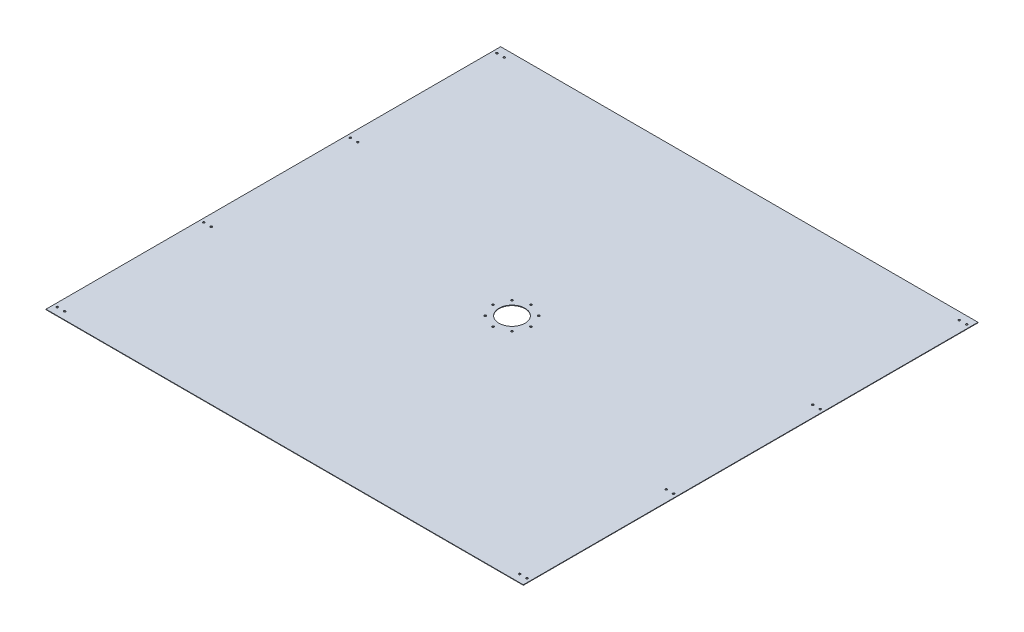
ISO-10303-21;
HEADER;
FILE_DESCRIPTION(('STEP AP214'),'2;1');
FILE_NAME('part.step','',(''),(''),'','','');
FILE_SCHEMA(('AUTOMOTIVE_DESIGN { 1 0 10303 214 1 1 1 1 }'));
ENDSEC;
DATA;
#1=APPLICATION_CONTEXT('core data for automotive mechanical design processes');
#2=APPLICATION_PROTOCOL_DEFINITION('international standard','automotive_design',2000,#1);
#3=PRODUCT_CONTEXT('',#1,'mechanical');
#4=PRODUCT('Part','Part','',(#3));
#5=PRODUCT_RELATED_PRODUCT_CATEGORY('part','',(#4));
#6=PRODUCT_DEFINITION_FORMATION('','',#4);
#7=PRODUCT_DEFINITION_CONTEXT('part definition',#1,'design');
#8=PRODUCT_DEFINITION('design','',#6,#7);
#9=PRODUCT_DEFINITION_SHAPE('','',#8);
#10=(LENGTH_UNIT() NAMED_UNIT(*) SI_UNIT(.MILLI.,.METRE.));
#11=(NAMED_UNIT(*) PLANE_ANGLE_UNIT() SI_UNIT($,.RADIAN.));
#12=(NAMED_UNIT(*) SI_UNIT($,.STERADIAN.) SOLID_ANGLE_UNIT());
#13=UNCERTAINTY_MEASURE_WITH_UNIT(LENGTH_MEASURE(1.E-05),#10,'distance_accuracy_value','');
#14=(GEOMETRIC_REPRESENTATION_CONTEXT(3) GLOBAL_UNCERTAINTY_ASSIGNED_CONTEXT((#13)) GLOBAL_UNIT_ASSIGNED_CONTEXT((#10,
#11,#12)) REPRESENTATION_CONTEXT('',''));
#15=CARTESIAN_POINT('',(0.,0.,0.));
#16=DIRECTION('',(0.,0.,1.));
#17=DIRECTION('',(1.,0.,0.));
#18=AXIS2_PLACEMENT_3D('',#15,#16,#17);
#19=CARTESIAN_POINT('',(-610.,0.,-589.4679746));
#20=DIRECTION('',(0.,1.,0.));
#21=DIRECTION('',(0.,0.,1.));
#22=AXIS2_PLACEMENT_3D('',#19,#20,#21);
#23=CYLINDRICAL_SURFACE('',#22,2.64999999999999);
#24=CARTESIAN_POINT('',(-610.,0.,-589.4679746));
#25=DIRECTION('',(0.,1.,0.));
#26=DIRECTION('',(0.,0.,1.));
#27=AXIS2_PLACEMENT_3D('',#24,#25,#26);
#28=CIRCLE('',#27,2.64999999999999);
#29=CARTESIAN_POINT('',(-610.,0.,-586.8179746));
#30=VERTEX_POINT('',#29);
#31=EDGE_CURVE('E53',#30,#30,#28,.T.);
#32=ORIENTED_EDGE('',*,*,#31,.F.);
#33=EDGE_LOOP('',(#32));
#34=FACE_BOUND('',#33,.T.);
#35=CARTESIAN_POINT('',(-610.,1.27,-589.4679746));
#36=DIRECTION('',(0.,1.,0.));
#37=DIRECTION('',(0.,0.,1.));
#38=AXIS2_PLACEMENT_3D('',#35,#36,#37);
#39=CIRCLE('',#38,2.64999999999999);
#40=CARTESIAN_POINT('',(-610.,1.27,-586.8179746));
#41=VERTEX_POINT('',#40);
#42=EDGE_CURVE('E13',#41,#41,#39,.T.);
#43=ORIENTED_EDGE('',*,*,#42,.T.);
#44=EDGE_LOOP('',(#43));
#45=FACE_BOUND('',#44,.T.);
#46=ADVANCED_FACE('F47',(#34,#45),#23,.F.);
#47=CARTESIAN_POINT('',(-610.,0.,-196.4453164));
#48=DIRECTION('',(0.,1.,0.));
#49=DIRECTION('',(0.,0.,1.));
#50=AXIS2_PLACEMENT_3D('',#47,#48,#49);
#51=CYLINDRICAL_SURFACE('',#50,2.64999999999999);
#52=CARTESIAN_POINT('',(-610.,0.,-196.4453164));
#53=DIRECTION('',(0.,1.,0.));
#54=DIRECTION('',(0.,0.,1.));
#55=AXIS2_PLACEMENT_3D('',#52,#53,#54);
#56=CIRCLE('',#55,2.64999999999999);
#57=CARTESIAN_POINT('',(-610.,0.,-193.7953164));
#58=VERTEX_POINT('',#57);
#59=EDGE_CURVE('E161',#58,#58,#56,.T.);
#60=ORIENTED_EDGE('',*,*,#59,.F.);
#61=EDGE_LOOP('',(#60));
#62=FACE_BOUND('',#61,.T.);
#63=CARTESIAN_POINT('',(-610.,1.27,-196.4453164));
#64=DIRECTION('',(0.,1.,0.));
#65=DIRECTION('',(0.,0.,1.));
#66=AXIS2_PLACEMENT_3D('',#63,#64,#65);
#67=CIRCLE('',#66,2.64999999999999);
#68=CARTESIAN_POINT('',(-610.,1.27,-193.7953164));
#69=VERTEX_POINT('',#68);
#70=EDGE_CURVE('E165',#69,#69,#67,.T.);
#71=ORIENTED_EDGE('',*,*,#70,.T.);
#72=EDGE_LOOP('',(#71));
#73=FACE_BOUND('',#72,.T.);
#74=ADVANCED_FACE('F175',(#62,#73),#51,.F.);
#75=CARTESIAN_POINT('',(-610.,0.,196.5773418));
#76=DIRECTION('',(0.,1.,0.));
#77=DIRECTION('',(0.,0.,1.));
#78=AXIS2_PLACEMENT_3D('',#75,#76,#77);
#79=CYLINDRICAL_SURFACE('',#78,2.64999999999999);
#80=CARTESIAN_POINT('',(-610.,0.,196.5773418));
#81=DIRECTION('',(0.,1.,0.));
#82=DIRECTION('',(0.,0.,1.));
#83=AXIS2_PLACEMENT_3D('',#80,#81,#82);
#84=CIRCLE('',#83,2.64999999999999);
#85=CARTESIAN_POINT('',(-610.,0.,199.2273418));
#86=VERTEX_POINT('',#85);
#87=EDGE_CURVE('E155',#86,#86,#84,.T.);
#88=ORIENTED_EDGE('',*,*,#87,.F.);
#89=EDGE_LOOP('',(#88));
#90=FACE_BOUND('',#89,.T.);
#91=CARTESIAN_POINT('',(-610.,1.27,196.5773418));
#92=DIRECTION('',(0.,1.,0.));
#93=DIRECTION('',(0.,0.,1.));
#94=AXIS2_PLACEMENT_3D('',#91,#92,#93);
#95=CIRCLE('',#94,2.64999999999999);
#96=CARTESIAN_POINT('',(-610.,1.27,199.2273418));
#97=VERTEX_POINT('',#96);
#98=EDGE_CURVE('E159',#97,#97,#95,.T.);
#99=ORIENTED_EDGE('',*,*,#98,.T.);
#100=EDGE_LOOP('',(#99));
#101=FACE_BOUND('',#100,.T.);
#102=ADVANCED_FACE('F210',(#90,#101),#79,.F.);
#103=CARTESIAN_POINT('',(-610.,0.,589.6));
#104=DIRECTION('',(0.,1.,0.));
#105=DIRECTION('',(0.,0.,1.));
#106=AXIS2_PLACEMENT_3D('',#103,#104,#105);
#107=CYLINDRICAL_SURFACE('',#106,2.64999999999999);
#108=CARTESIAN_POINT('',(-610.,0.,589.6));
#109=DIRECTION('',(0.,1.,0.));
#110=DIRECTION('',(0.,0.,1.));
#111=AXIS2_PLACEMENT_3D('',#108,#109,#110);
#112=CIRCLE('',#111,2.64999999999999);
#113=CARTESIAN_POINT('',(-610.,0.,592.25));
#114=VERTEX_POINT('',#113);
#115=EDGE_CURVE('E148',#114,#114,#112,.T.);
#116=ORIENTED_EDGE('',*,*,#115,.F.);
#117=EDGE_LOOP('',(#116));
#118=FACE_BOUND('',#117,.T.);
#119=CARTESIAN_POINT('',(-610.,1.27,589.6));
#120=DIRECTION('',(0.,1.,0.));
#121=DIRECTION('',(0.,0.,1.));
#122=AXIS2_PLACEMENT_3D('',#119,#120,#121);
#123=CIRCLE('',#122,2.64999999999999);
#124=CARTESIAN_POINT('',(-610.,1.27,592.25));
#125=VERTEX_POINT('',#124);
#126=EDGE_CURVE('E152',#125,#125,#123,.T.);
#127=ORIENTED_EDGE('',*,*,#126,.T.);
#128=EDGE_LOOP('',(#127));
#129=FACE_BOUND('',#128,.T.);
#130=ADVANCED_FACE('F206',(#118,#129),#107,.F.);
#131=CARTESIAN_POINT('',(-630.,0.,-589.4679746));
#132=DIRECTION('',(0.,1.,0.));
#133=DIRECTION('',(0.,0.,1.));
#134=AXIS2_PLACEMENT_3D('',#131,#132,#133);
#135=CYLINDRICAL_SURFACE('',#134,2.64999999999999);
#136=CARTESIAN_POINT('',(-630.,0.,-589.4679746));
#137=DIRECTION('',(0.,1.,0.));
#138=DIRECTION('',(0.,0.,1.));
#139=AXIS2_PLACEMENT_3D('',#136,#137,#138);
#140=CIRCLE('',#139,2.64999999999999);
#141=CARTESIAN_POINT('',(-630.,0.,-586.8179746));
#142=VERTEX_POINT('',#141);
#143=EDGE_CURVE('E142',#142,#142,#140,.T.);
#144=ORIENTED_EDGE('',*,*,#143,.F.);
#145=EDGE_LOOP('',(#144));
#146=FACE_BOUND('',#145,.T.);
#147=CARTESIAN_POINT('',(-630.,1.27,-589.4679746));
#148=DIRECTION('',(0.,1.,0.));
#149=DIRECTION('',(0.,0.,1.));
#150=AXIS2_PLACEMENT_3D('',#147,#148,#149);
#151=CIRCLE('',#150,2.64999999999999);
#152=CARTESIAN_POINT('',(-630.,1.27,-586.8179746));
#153=VERTEX_POINT('',#152);
#154=EDGE_CURVE('E146',#153,#153,#151,.T.);
#155=ORIENTED_EDGE('',*,*,#154,.T.);
#156=EDGE_LOOP('',(#155));
#157=FACE_BOUND('',#156,.T.);
#158=ADVANCED_FACE('F202',(#146,#157),#135,.F.);
#159=CARTESIAN_POINT('',(-630.,0.,-196.4453164));
#160=DIRECTION('',(0.,1.,0.));
#161=DIRECTION('',(0.,0.,1.));
#162=AXIS2_PLACEMENT_3D('',#159,#160,#161);
#163=CYLINDRICAL_SURFACE('',#162,2.64999999999999);
#164=CARTESIAN_POINT('',(-630.,0.,-196.4453164));
#165=DIRECTION('',(0.,1.,0.));
#166=DIRECTION('',(0.,0.,1.));
#167=AXIS2_PLACEMENT_3D('',#164,#165,#166);
#168=CIRCLE('',#167,2.64999999999999);
#169=CARTESIAN_POINT('',(-630.,0.,-193.7953164));
#170=VERTEX_POINT('',#169);
#171=EDGE_CURVE('E130',#170,#170,#168,.T.);
#172=ORIENTED_EDGE('',*,*,#171,.F.);
#173=EDGE_LOOP('',(#172));
#174=FACE_BOUND('',#173,.T.);
#175=CARTESIAN_POINT('',(-630.,1.27,-196.4453164));
#176=DIRECTION('',(0.,1.,0.));
#177=DIRECTION('',(0.,0.,1.));
#178=AXIS2_PLACEMENT_3D('',#175,#176,#177);
#179=CIRCLE('',#178,2.64999999999999);
#180=CARTESIAN_POINT('',(-630.,1.27,-193.7953164));
#181=VERTEX_POINT('',#180);
#182=EDGE_CURVE('E135',#181,#181,#179,.T.);
#183=ORIENTED_EDGE('',*,*,#182,.T.);
#184=EDGE_LOOP('',(#183));
#185=FACE_BOUND('',#184,.T.);
#186=ADVANCED_FACE('F197',(#174,#185),#163,.F.);
#187=CARTESIAN_POINT('',(-657.225,1.27,609.6));
#188=DIRECTION('',(0.,0.,-1.));
#189=DIRECTION('',(-1.,0.,0.));
#190=AXIS2_PLACEMENT_3D('',#187,#188,#189);
#191=PLANE('',#190);
#192=DIRECTION('',(0.,1.,0.));
#193=VECTOR('',#192,1.);
#194=CARTESIAN_POINT('',(640.,-1.27,609.6));
#195=LINE('',#194,#193);
#196=CARTESIAN_POINT('',(640.,0.,609.6));
#197=VERTEX_POINT('',#196);
#198=CARTESIAN_POINT('',(640.,1.27,609.6));
#199=VERTEX_POINT('',#198);
#200=EDGE_CURVE('E60',#197,#199,#195,.T.);
#201=ORIENTED_EDGE('',*,*,#200,.T.);
#202=DIRECTION('',(1.,0.,0.));
#203=VECTOR('',#202,1.);
#204=CARTESIAN_POINT('',(-657.225,1.27,609.6));
#205=LINE('',#204,#203);
#206=CARTESIAN_POINT('',(-640.,1.27,609.6));
#207=VERTEX_POINT('',#206);
#208=EDGE_CURVE('E107',#207,#199,#205,.T.);
#209=ORIENTED_EDGE('',*,*,#208,.F.);
#210=DIRECTION('',(0.,1.,0.));
#211=VECTOR('',#210,1.);
#212=CARTESIAN_POINT('',(-640.,-1.27,609.6));
#213=LINE('',#212,#211);
#214=CARTESIAN_POINT('',(-640.,0.,609.6));
#215=VERTEX_POINT('',#214);
#216=EDGE_CURVE('E87',#215,#207,#213,.T.);
#217=ORIENTED_EDGE('',*,*,#216,.F.);
#218=DIRECTION('',(1.,0.,0.));
#219=VECTOR('',#218,1.);
#220=CARTESIAN_POINT('',(-657.225,0.,609.6));
#221=LINE('',#220,#219);
#222=EDGE_CURVE('E108',#215,#197,#221,.T.);
#223=ORIENTED_EDGE('',*,*,#222,.T.);
#224=EDGE_LOOP('',(#201,#209,#217,#223));
#225=FACE_BOUND('',#224,.T.);
#226=ADVANCED_FACE('F188',(#225),#191,.F.);
#227=CARTESIAN_POINT('',(-657.225,1.27,-609.6));
#228=DIRECTION('',(0.,0.,-1.));
#229=DIRECTION('',(-1.,0.,0.));
#230=AXIS2_PLACEMENT_3D('',#227,#228,#229);
#231=PLANE('',#230);
#232=DIRECTION('',(1.,0.,0.));
#233=VECTOR('',#232,1.);
#234=CARTESIAN_POINT('',(-657.225,1.27,-609.6));
#235=LINE('',#234,#233);
#236=CARTESIAN_POINT('',(-640.,1.27,-609.6));
#237=VERTEX_POINT('',#236);
#238=CARTESIAN_POINT('',(640.,1.27,-609.6));
#239=VERTEX_POINT('',#238);
#240=EDGE_CURVE('E100',#237,#239,#235,.T.);
#241=ORIENTED_EDGE('',*,*,#240,.T.);
#242=DIRECTION('',(0.,1.,0.));
#243=VECTOR('',#242,1.);
#244=CARTESIAN_POINT('',(640.,-1.27,-609.6));
#245=LINE('',#244,#243);
#246=CARTESIAN_POINT('',(640.,0.,-609.6));
#247=VERTEX_POINT('',#246);
#248=EDGE_CURVE('E92',#247,#239,#245,.T.);
#249=ORIENTED_EDGE('',*,*,#248,.F.);
#250=DIRECTION('',(1.,0.,0.));
#251=VECTOR('',#250,1.);
#252=CARTESIAN_POINT('',(-657.225,0.,-609.6));
#253=LINE('',#252,#251);
#254=CARTESIAN_POINT('',(-640.,0.,-609.6));
#255=VERTEX_POINT('',#254);
#256=EDGE_CURVE('E102',#255,#247,#253,.T.);
#257=ORIENTED_EDGE('',*,*,#256,.F.);
#258=DIRECTION('',(0.,1.,0.));
#259=VECTOR('',#258,1.);
#260=CARTESIAN_POINT('',(-640.,-1.27,-609.6));
#261=LINE('',#260,#259);
#262=EDGE_CURVE('E68',#255,#237,#261,.T.);
#263=ORIENTED_EDGE('',*,*,#262,.T.);
#264=EDGE_LOOP('',(#241,#249,#257,#263));
#265=FACE_BOUND('',#264,.T.);
#266=ADVANCED_FACE('F98',(#265),#231,.T.);
#267=CARTESIAN_POINT('',(0.,1.27,0.));
#268=DIRECTION('',(0.,-1.,0.));
#269=DIRECTION('',(0.,0.,-1.));
#270=AXIS2_PLACEMENT_3D('',#267,#268,#269);
#271=PLANE('',#270);
#272=CARTESIAN_POINT('',(-35.9210244842762,1.26999999999999,-35.9210244842771));
#273=DIRECTION('',(0.,-1.,0.));
#274=DIRECTION('',(0.,0.,-1.));
#275=AXIS2_PLACEMENT_3D('',#272,#273,#274);
#276=CIRCLE('',#275,2.64999999999999);
#277=CARTESIAN_POINT('',(-35.9210244842762,1.26999999999999,-38.5710244842771));
#278=VERTEX_POINT('',#277);
#279=EDGE_CURVE('E596',#278,#278,#276,.T.);
#280=ORIENTED_EDGE('',*,*,#279,.T.);
#281=EDGE_LOOP('',(#280));
#282=FACE_BOUND('',#281,.T.);
#283=CARTESIAN_POINT('',(-50.8,1.26999999999999,-5.32101756039694E-13));
#284=DIRECTION('',(0.,-1.,0.));
#285=DIRECTION('',(0.,0.,-1.));
#286=AXIS2_PLACEMENT_3D('',#283,#284,#285);
#287=CIRCLE('',#286,2.64999999999999);
#288=CARTESIAN_POINT('',(-50.8,1.26999999999999,-2.65000000000052));
#289=VERTEX_POINT('',#288);
#290=EDGE_CURVE('E590',#289,#289,#287,.T.);
#291=ORIENTED_EDGE('',*,*,#290,.T.);
#292=EDGE_LOOP('',(#291));
#293=FACE_BOUND('',#292,.T.);
#294=CARTESIAN_POINT('',(-35.9210244842769,1.26999999999999,35.9210244842763));
#295=DIRECTION('',(0.,-1.,0.));
#296=DIRECTION('',(0.,0.,-1.));
#297=AXIS2_PLACEMENT_3D('',#294,#295,#296);
#298=CIRCLE('',#297,2.64999999999999);
#299=CARTESIAN_POINT('',(-35.9210244842769,1.26999999999999,33.2710244842763));
#300=VERTEX_POINT('',#299);
#301=EDGE_CURVE('E580',#300,#300,#298,.T.);
#302=ORIENTED_EDGE('',*,*,#301,.T.);
#303=EDGE_LOOP('',(#302));
#304=FACE_BOUND('',#303,.T.);
#305=CARTESIAN_POINT('',(0.,1.26999999999999,50.8));
#306=DIRECTION('',(0.,-1.,0.));
#307=DIRECTION('',(0.,0.,-1.));
#308=AXIS2_PLACEMENT_3D('',#305,#306,#307);
#309=CIRCLE('',#308,2.64999999999999);
#310=CARTESIAN_POINT('',(0.,1.26999999999999,48.15));
#311=VERTEX_POINT('',#310);
#312=EDGE_CURVE('E573',#311,#311,#309,.T.);
#313=ORIENTED_EDGE('',*,*,#312,.T.);
#314=EDGE_LOOP('',(#313));
#315=FACE_BOUND('',#314,.T.);
#316=CARTESIAN_POINT('',(35.9210244842764,1.26999999999999,35.9210244842768));
#317=DIRECTION('',(0.,-1.,0.));
#318=DIRECTION('',(0.,0.,-1.));
#319=AXIS2_PLACEMENT_3D('',#316,#317,#318);
#320=CIRCLE('',#319,2.64999999999999);
#321=CARTESIAN_POINT('',(35.9210244842764,1.26999999999999,33.2710244842768));
#322=VERTEX_POINT('',#321);
#323=EDGE_CURVE('E567',#322,#322,#320,.T.);
#324=ORIENTED_EDGE('',*,*,#323,.T.);
#325=EDGE_LOOP('',(#324));
#326=FACE_BOUND('',#325,.T.);
#327=CARTESIAN_POINT('',(50.8,1.26999999999999,1.77367252013231E-13));
#328=DIRECTION('',(0.,-1.,0.));
#329=DIRECTION('',(0.,0.,-1.));
#330=AXIS2_PLACEMENT_3D('',#327,#328,#329);
#331=CIRCLE('',#330,2.64999999999999);
#332=CARTESIAN_POINT('',(50.8,1.26999999999999,-2.64999999999981));
#333=VERTEX_POINT('',#332);
#334=EDGE_CURVE('E557',#333,#333,#331,.T.);
#335=ORIENTED_EDGE('',*,*,#334,.T.);
#336=EDGE_LOOP('',(#335));
#337=FACE_BOUND('',#336,.T.);
#338=CARTESIAN_POINT('',(35.9210244842767,1.26999999999999,-35.9210244842766));
#339=DIRECTION('',(0.,-1.,0.));
#340=DIRECTION('',(0.,0.,-1.));
#341=AXIS2_PLACEMENT_3D('',#338,#339,#340);
#342=CIRCLE('',#341,2.64999999999999);
#343=CARTESIAN_POINT('',(35.9210244842767,1.26999999999999,-38.5710244842765));
#344=VERTEX_POINT('',#343);
#345=EDGE_CURVE('E546',#344,#344,#342,.T.);
#346=ORIENTED_EDGE('',*,*,#345,.T.);
#347=EDGE_LOOP('',(#346));
#348=FACE_BOUND('',#347,.T.);
#349=CARTESIAN_POINT('',(0.,1.26999999999999,-50.8));
#350=DIRECTION('',(0.,-1.,0.));
#351=DIRECTION('',(0.,0.,-1.));
#352=AXIS2_PLACEMENT_3D('',#349,#350,#351);
#353=CIRCLE('',#352,2.64999999999999);
#354=CARTESIAN_POINT('',(0.,1.26999999999999,-53.45));
#355=VERTEX_POINT('',#354);
#356=EDGE_CURVE('E470',#355,#355,#353,.T.);
#357=ORIENTED_EDGE('',*,*,#356,.T.);
#358=EDGE_LOOP('',(#357));
#359=FACE_BOUND('',#358,.T.);
#360=CARTESIAN_POINT('',(0.,1.27,0.));
#361=DIRECTION('',(0.,1.,0.));
#362=DIRECTION('',(0.,0.,1.));
#363=AXIS2_PLACEMENT_3D('',#360,#361,#362);
#364=CIRCLE('',#363,34.925);
#365=CARTESIAN_POINT('',(0.,1.27,34.925));
#366=VERTEX_POINT('',#365);
#367=EDGE_CURVE('E469',#366,#366,#364,.T.);
#368=ORIENTED_EDGE('',*,*,#367,.F.);
#369=EDGE_LOOP('',(#368));
#370=FACE_BOUND('',#369,.T.);
#371=CARTESIAN_POINT('',(630.,1.27,-196.4453164));
#372=DIRECTION('',(0.,-1.,0.));
#373=DIRECTION('',(0.,0.,1.));
#374=AXIS2_PLACEMENT_3D('',#371,#372,#373);
#375=CIRCLE('',#374,2.64999999999999);
#376=CARTESIAN_POINT('',(630.,1.27,-193.7953164));
#377=VERTEX_POINT('',#376);
#378=EDGE_CURVE('E449',#377,#377,#375,.T.);
#379=ORIENTED_EDGE('',*,*,#378,.T.);
#380=EDGE_LOOP('',(#379));
#381=FACE_BOUND('',#380,.T.);
#382=CARTESIAN_POINT('',(610.,1.27,196.5773418));
#383=DIRECTION('',(0.,-1.,0.));
#384=DIRECTION('',(0.,0.,1.));
#385=AXIS2_PLACEMENT_3D('',#382,#383,#384);
#386=CIRCLE('',#385,2.64999999999999);
#387=CARTESIAN_POINT('',(610.,1.27,199.2273418));
#388=VERTEX_POINT('',#387);
#389=EDGE_CURVE('E457',#388,#388,#386,.T.);
#390=ORIENTED_EDGE('',*,*,#389,.T.);
#391=EDGE_LOOP('',(#390));
#392=FACE_BOUND('',#391,.T.);
#393=CARTESIAN_POINT('',(630.,1.27,196.5773418));
#394=DIRECTION('',(0.,-1.,0.));
#395=DIRECTION('',(0.,0.,1.));
#396=AXIS2_PLACEMENT_3D('',#393,#394,#395);
#397=CIRCLE('',#396,2.64999999999999);
#398=CARTESIAN_POINT('',(630.,1.27,199.2273418));
#399=VERTEX_POINT('',#398);
#400=EDGE_CURVE('E428',#399,#399,#397,.T.);
#401=ORIENTED_EDGE('',*,*,#400,.T.);
#402=EDGE_LOOP('',(#401));
#403=FACE_BOUND('',#402,.T.);
#404=CARTESIAN_POINT('',(610.,1.27,589.6));
#405=DIRECTION('',(0.,-1.,0.));
#406=DIRECTION('',(0.,0.,1.));
#407=AXIS2_PLACEMENT_3D('',#404,#405,#406);
#408=CIRCLE('',#407,2.64999999999999);
#409=CARTESIAN_POINT('',(610.,1.27,592.25));
#410=VERTEX_POINT('',#409);
#411=EDGE_CURVE('E436',#410,#410,#408,.T.);
#412=ORIENTED_EDGE('',*,*,#411,.T.);
#413=EDGE_LOOP('',(#412));
#414=FACE_BOUND('',#413,.T.);
#415=CARTESIAN_POINT('',(610.,1.27,-589.4679746));
#416=DIRECTION('',(0.,-1.,0.));
#417=DIRECTION('',(0.,0.,1.));
#418=AXIS2_PLACEMENT_3D('',#415,#416,#417);
#419=CIRCLE('',#418,2.64999999999999);
#420=CARTESIAN_POINT('',(610.,1.27,-586.8179746));
#421=VERTEX_POINT('',#420);
#422=EDGE_CURVE('E468',#421,#421,#419,.T.);
#423=ORIENTED_EDGE('',*,*,#422,.T.);
#424=EDGE_LOOP('',(#423));
#425=FACE_BOUND('',#424,.T.);
#426=CARTESIAN_POINT('',(630.,1.27,-589.4679746));
#427=DIRECTION('',(0.,-1.,0.));
#428=DIRECTION('',(0.,0.,1.));
#429=AXIS2_PLACEMENT_3D('',#426,#427,#428);
#430=CIRCLE('',#429,2.64999999999999);
#431=CARTESIAN_POINT('',(630.,1.27,-586.8179746));
#432=VERTEX_POINT('',#431);
#433=EDGE_CURVE('E476',#432,#432,#430,.T.);
#434=ORIENTED_EDGE('',*,*,#433,.T.);
#435=EDGE_LOOP('',(#434));
#436=FACE_BOUND('',#435,.T.);
#437=CARTESIAN_POINT('',(610.,1.27,-196.4453164));
#438=DIRECTION('',(0.,-1.,0.));
#439=DIRECTION('',(0.,0.,1.));
#440=AXIS2_PLACEMENT_3D('',#437,#438,#439);
#441=CIRCLE('',#440,2.64999999999999);
#442=CARTESIAN_POINT('',(610.,1.27,-193.7953164));
#443=VERTEX_POINT('',#442);
#444=EDGE_CURVE('E481',#443,#443,#441,.T.);
#445=ORIENTED_EDGE('',*,*,#444,.T.);
#446=EDGE_LOOP('',(#445));
#447=FACE_BOUND('',#446,.T.);
#448=CARTESIAN_POINT('',(630.,1.27,589.6));
#449=DIRECTION('',(0.,-1.,0.));
#450=DIRECTION('',(0.,0.,1.));
#451=AXIS2_PLACEMENT_3D('',#448,#449,#450);
#452=CIRCLE('',#451,2.64999999999999);
#453=CARTESIAN_POINT('',(630.,1.27,592.25));
#454=VERTEX_POINT('',#453);
#455=EDGE_CURVE('E419',#454,#454,#452,.T.);
#456=ORIENTED_EDGE('',*,*,#455,.T.);
#457=EDGE_LOOP('',(#456));
#458=FACE_BOUND('',#457,.T.);
#459=CARTESIAN_POINT('',(-630.,1.27,196.5773418));
#460=DIRECTION('',(0.,1.,0.));
#461=DIRECTION('',(0.,0.,1.));
#462=AXIS2_PLACEMENT_3D('',#459,#460,#461);
#463=CIRCLE('',#462,2.64999999999999);
#464=CARTESIAN_POINT('',(-630.,1.27,199.2273418));
#465=VERTEX_POINT('',#464);
#466=EDGE_CURVE('E408',#465,#465,#463,.T.);
#467=ORIENTED_EDGE('',*,*,#466,.F.);
#468=EDGE_LOOP('',(#467));
#469=FACE_BOUND('',#468,.T.);
#470=CARTESIAN_POINT('',(-630.,1.27,589.6));
#471=DIRECTION('',(0.,1.,0.));
#472=DIRECTION('',(0.,0.,1.));
#473=AXIS2_PLACEMENT_3D('',#470,#471,#472);
#474=CIRCLE('',#473,2.64999999999999);
#475=CARTESIAN_POINT('',(-630.,1.27,592.25));
#476=VERTEX_POINT('',#475);
#477=EDGE_CURVE('E406',#476,#476,#474,.T.);
#478=ORIENTED_EDGE('',*,*,#477,.F.);
#479=EDGE_LOOP('',(#478));
#480=FACE_BOUND('',#479,.T.);
#481=DIRECTION('',(0.,0.,-1.));
#482=VECTOR('',#481,1.);
#483=CARTESIAN_POINT('',(640.,1.27,-609.6));
#484=LINE('',#483,#482);
#485=EDGE_CURVE('E93',#199,#239,#484,.T.);
#486=ORIENTED_EDGE('',*,*,#485,.T.);
#487=ORIENTED_EDGE('',*,*,#240,.F.);
#488=DIRECTION('',(0.,0.,1.));
#489=VECTOR('',#488,1.);
#490=CARTESIAN_POINT('',(-640.,1.27,-609.6));
#491=LINE('',#490,#489);
#492=EDGE_CURVE('E84',#237,#207,#491,.T.);
#493=ORIENTED_EDGE('',*,*,#492,.T.);
#494=ORIENTED_EDGE('',*,*,#208,.T.);
#495=EDGE_LOOP('',(#486,#487,#493,#494));
#496=FACE_BOUND('',#495,.T.);
#497=ORIENTED_EDGE('',*,*,#182,.F.);
#498=EDGE_LOOP('',(#497));
#499=FACE_BOUND('',#498,.T.);
#500=ORIENTED_EDGE('',*,*,#154,.F.);
#501=EDGE_LOOP('',(#500));
#502=FACE_BOUND('',#501,.T.);
#503=ORIENTED_EDGE('',*,*,#126,.F.);
#504=EDGE_LOOP('',(#503));
#505=FACE_BOUND('',#504,.T.);
#506=ORIENTED_EDGE('',*,*,#98,.F.);
#507=EDGE_LOOP('',(#506));
#508=FACE_BOUND('',#507,.T.);
#509=ORIENTED_EDGE('',*,*,#70,.F.);
#510=EDGE_LOOP('',(#509));
#511=FACE_BOUND('',#510,.T.);
#512=ORIENTED_EDGE('',*,*,#42,.F.);
#513=EDGE_LOOP('',(#512));
#514=FACE_BOUND('',#513,.T.);
#515=ADVANCED_FACE('F105',(#282,#293,#304,#315,#326,#337,#348,#359,#370,#381,#392,#403,#414,
#425,#436,#447,#458,#469,#480,#496,#499,#502,#505,#508,#511,#514),#271,.F.);
#516=CARTESIAN_POINT('',(0.,0.,0.));
#517=DIRECTION('',(0.,-1.,0.));
#518=DIRECTION('',(0.,0.,-1.));
#519=AXIS2_PLACEMENT_3D('',#516,#517,#518);
#520=PLANE('',#519);
#521=CARTESIAN_POINT('',(-35.9210244842762,0.,-35.9210244842771));
#522=DIRECTION('',(0.,-1.,0.));
#523=DIRECTION('',(0.,0.,-1.));
#524=AXIS2_PLACEMENT_3D('',#521,#522,#523);
#525=CIRCLE('',#524,2.64999999999999);
#526=CARTESIAN_POINT('',(-35.9210244842762,0.,-38.5710244842771));
#527=VERTEX_POINT('',#526);
#528=EDGE_CURVE('E598',#527,#527,#525,.T.);
#529=ORIENTED_EDGE('',*,*,#528,.F.);
#530=EDGE_LOOP('',(#529));
#531=FACE_BOUND('',#530,.T.);
#532=CARTESIAN_POINT('',(-50.8,0.,-5.32101756039694E-13));
#533=DIRECTION('',(0.,-1.,0.));
#534=DIRECTION('',(0.,0.,-1.));
#535=AXIS2_PLACEMENT_3D('',#532,#533,#534);
#536=CIRCLE('',#535,2.64999999999999);
#537=CARTESIAN_POINT('',(-50.8,0.,-2.65000000000052));
#538=VERTEX_POINT('',#537);
#539=EDGE_CURVE('E592',#538,#538,#536,.T.);
#540=ORIENTED_EDGE('',*,*,#539,.F.);
#541=EDGE_LOOP('',(#540));
#542=FACE_BOUND('',#541,.T.);
#543=CARTESIAN_POINT('',(-35.9210244842769,0.,35.9210244842763));
#544=DIRECTION('',(0.,-1.,0.));
#545=DIRECTION('',(0.,0.,-1.));
#546=AXIS2_PLACEMENT_3D('',#543,#544,#545);
#547=CIRCLE('',#546,2.64999999999999);
#548=CARTESIAN_POINT('',(-35.9210244842769,0.,33.2710244842763));
#549=VERTEX_POINT('',#548);
#550=EDGE_CURVE('E586',#549,#549,#547,.T.);
#551=ORIENTED_EDGE('',*,*,#550,.F.);
#552=EDGE_LOOP('',(#551));
#553=FACE_BOUND('',#552,.T.);
#554=CARTESIAN_POINT('',(0.,0.,50.8));
#555=DIRECTION('',(0.,-1.,0.));
#556=DIRECTION('',(0.,0.,-1.));
#557=AXIS2_PLACEMENT_3D('',#554,#555,#556);
#558=CIRCLE('',#557,2.64999999999999);
#559=CARTESIAN_POINT('',(0.,0.,48.15));
#560=VERTEX_POINT('',#559);
#561=EDGE_CURVE('E576',#560,#560,#558,.T.);
#562=ORIENTED_EDGE('',*,*,#561,.F.);
#563=EDGE_LOOP('',(#562));
#564=FACE_BOUND('',#563,.T.);
#565=CARTESIAN_POINT('',(35.9210244842764,0.,35.9210244842768));
#566=DIRECTION('',(0.,-1.,0.));
#567=DIRECTION('',(0.,0.,-1.));
#568=AXIS2_PLACEMENT_3D('',#565,#566,#567);
#569=CIRCLE('',#568,2.64999999999999);
#570=CARTESIAN_POINT('',(35.9210244842764,0.,33.2710244842768));
#571=VERTEX_POINT('',#570);
#572=EDGE_CURVE('E569',#571,#571,#569,.T.);
#573=ORIENTED_EDGE('',*,*,#572,.F.);
#574=EDGE_LOOP('',(#573));
#575=FACE_BOUND('',#574,.T.);
#576=CARTESIAN_POINT('',(50.8,0.,1.77367252013231E-13));
#577=DIRECTION('',(0.,-1.,0.));
#578=DIRECTION('',(0.,0.,-1.));
#579=AXIS2_PLACEMENT_3D('',#576,#577,#578);
#580=CIRCLE('',#579,2.64999999999999);
#581=CARTESIAN_POINT('',(50.8,0.,-2.64999999999981));
#582=VERTEX_POINT('',#581);
#583=EDGE_CURVE('E563',#582,#582,#580,.T.);
#584=ORIENTED_EDGE('',*,*,#583,.F.);
#585=EDGE_LOOP('',(#584));
#586=FACE_BOUND('',#585,.T.);
#587=CARTESIAN_POINT('',(35.9210244842767,0.,-35.9210244842766));
#588=DIRECTION('',(0.,-1.,0.));
#589=DIRECTION('',(0.,0.,-1.));
#590=AXIS2_PLACEMENT_3D('',#587,#588,#589);
#591=CIRCLE('',#590,2.64999999999999);
#592=CARTESIAN_POINT('',(35.9210244842767,0.,-38.5710244842765));
#593=VERTEX_POINT('',#592);
#594=EDGE_CURVE('E550',#593,#593,#591,.T.);
#595=ORIENTED_EDGE('',*,*,#594,.F.);
#596=EDGE_LOOP('',(#595));
#597=FACE_BOUND('',#596,.T.);
#598=CARTESIAN_POINT('',(0.,0.,-50.8));
#599=DIRECTION('',(0.,-1.,0.));
#600=DIRECTION('',(0.,0.,-1.));
#601=AXIS2_PLACEMENT_3D('',#598,#599,#600);
#602=CIRCLE('',#601,2.64999999999999);
#603=CARTESIAN_POINT('',(0.,0.,-53.45));
#604=VERTEX_POINT('',#603);
#605=EDGE_CURVE('E542',#604,#604,#602,.T.);
#606=ORIENTED_EDGE('',*,*,#605,.F.);
#607=EDGE_LOOP('',(#606));
#608=FACE_BOUND('',#607,.T.);
#609=CARTESIAN_POINT('',(0.,0.,0.));
#610=DIRECTION('',(0.,1.,0.));
#611=DIRECTION('',(0.,0.,1.));
#612=AXIS2_PLACEMENT_3D('',#609,#610,#611);
#613=CIRCLE('',#612,34.925);
#614=CARTESIAN_POINT('',(0.,0.,34.925));
#615=VERTEX_POINT('',#614);
#616=EDGE_CURVE('E463',#615,#615,#613,.T.);
#617=ORIENTED_EDGE('',*,*,#616,.T.);
#618=EDGE_LOOP('',(#617));
#619=FACE_BOUND('',#618,.T.);
#620=CARTESIAN_POINT('',(630.,0.,-196.4453164));
#621=DIRECTION('',(0.,-1.,0.));
#622=DIRECTION('',(0.,0.,1.));
#623=AXIS2_PLACEMENT_3D('',#620,#621,#622);
#624=CIRCLE('',#623,2.64999999999999);
#625=CARTESIAN_POINT('',(630.,0.,-193.7953164));
#626=VERTEX_POINT('',#625);
#627=EDGE_CURVE('E452',#626,#626,#624,.T.);
#628=ORIENTED_EDGE('',*,*,#627,.F.);
#629=EDGE_LOOP('',(#628));
#630=FACE_BOUND('',#629,.T.);
#631=CARTESIAN_POINT('',(610.,0.,196.5773418));
#632=DIRECTION('',(0.,-1.,0.));
#633=DIRECTION('',(0.,0.,1.));
#634=AXIS2_PLACEMENT_3D('',#631,#632,#633);
#635=CIRCLE('',#634,2.64999999999999);
#636=CARTESIAN_POINT('',(610.,0.,199.2273418));
#637=VERTEX_POINT('',#636);
#638=EDGE_CURVE('E432',#637,#637,#635,.T.);
#639=ORIENTED_EDGE('',*,*,#638,.F.);
#640=EDGE_LOOP('',(#639));
#641=FACE_BOUND('',#640,.T.);
#642=CARTESIAN_POINT('',(630.,0.,196.5773418));
#643=DIRECTION('',(0.,-1.,0.));
#644=DIRECTION('',(0.,0.,1.));
#645=AXIS2_PLACEMENT_3D('',#642,#643,#644);
#646=CIRCLE('',#645,2.64999999999999);
#647=CARTESIAN_POINT('',(630.,0.,199.2273418));
#648=VERTEX_POINT('',#647);
#649=EDGE_CURVE('E431',#648,#648,#646,.T.);
#650=ORIENTED_EDGE('',*,*,#649,.F.);
#651=EDGE_LOOP('',(#650));
#652=FACE_BOUND('',#651,.T.);
#653=CARTESIAN_POINT('',(610.,0.,589.6));
#654=DIRECTION('',(0.,-1.,0.));
#655=DIRECTION('',(0.,0.,1.));
#656=AXIS2_PLACEMENT_3D('',#653,#654,#655);
#657=CIRCLE('',#656,2.64999999999999);
#658=CARTESIAN_POINT('',(610.,0.,592.25));
#659=VERTEX_POINT('',#658);
#660=EDGE_CURVE('E445',#659,#659,#657,.T.);
#661=ORIENTED_EDGE('',*,*,#660,.F.);
#662=EDGE_LOOP('',(#661));
#663=FACE_BOUND('',#662,.T.);
#664=CARTESIAN_POINT('',(610.,0.,-589.4679746));
#665=DIRECTION('',(0.,-1.,0.));
#666=DIRECTION('',(0.,0.,1.));
#667=AXIS2_PLACEMENT_3D('',#664,#665,#666);
#668=CIRCLE('',#667,2.64999999999999);
#669=CARTESIAN_POINT('',(610.,0.,-586.8179746));
#670=VERTEX_POINT('',#669);
#671=EDGE_CURVE('E472',#670,#670,#668,.T.);
#672=ORIENTED_EDGE('',*,*,#671,.F.);
#673=EDGE_LOOP('',(#672));
#674=FACE_BOUND('',#673,.T.);
#675=CARTESIAN_POINT('',(630.,0.,-589.4679746));
#676=DIRECTION('',(0.,-1.,0.));
#677=DIRECTION('',(0.,0.,1.));
#678=AXIS2_PLACEMENT_3D('',#675,#676,#677);
#679=CIRCLE('',#678,2.64999999999999);
#680=CARTESIAN_POINT('',(630.,0.,-586.8179746));
#681=VERTEX_POINT('',#680);
#682=EDGE_CURVE('E484',#681,#681,#679,.T.);
#683=ORIENTED_EDGE('',*,*,#682,.F.);
#684=EDGE_LOOP('',(#683));
#685=FACE_BOUND('',#684,.T.);
#686=CARTESIAN_POINT('',(610.,0.,-196.4453164));
#687=DIRECTION('',(0.,-1.,0.));
#688=DIRECTION('',(0.,0.,1.));
#689=AXIS2_PLACEMENT_3D('',#686,#687,#688);
#690=CIRCLE('',#689,2.64999999999999);
#691=CARTESIAN_POINT('',(610.,0.,-193.7953164));
#692=VERTEX_POINT('',#691);
#693=EDGE_CURVE('E453',#692,#692,#690,.T.);
#694=ORIENTED_EDGE('',*,*,#693,.F.);
#695=EDGE_LOOP('',(#694));
#696=FACE_BOUND('',#695,.T.);
#697=CARTESIAN_POINT('',(630.,0.,589.6));
#698=DIRECTION('',(0.,-1.,0.));
#699=DIRECTION('',(0.,0.,1.));
#700=AXIS2_PLACEMENT_3D('',#697,#698,#699);
#701=CIRCLE('',#700,2.64999999999999);
#702=CARTESIAN_POINT('',(630.,0.,592.25));
#703=VERTEX_POINT('',#702);
#704=EDGE_CURVE('E418',#703,#703,#701,.T.);
#705=ORIENTED_EDGE('',*,*,#704,.F.);
#706=EDGE_LOOP('',(#705));
#707=FACE_BOUND('',#706,.T.);
#708=CARTESIAN_POINT('',(-630.,0.,196.5773418));
#709=DIRECTION('',(0.,1.,0.));
#710=DIRECTION('',(0.,0.,1.));
#711=AXIS2_PLACEMENT_3D('',#708,#709,#710);
#712=CIRCLE('',#711,2.64999999999999);
#713=CARTESIAN_POINT('',(-630.,0.,199.2273418));
#714=VERTEX_POINT('',#713);
#715=EDGE_CURVE('E414',#714,#714,#712,.T.);
#716=ORIENTED_EDGE('',*,*,#715,.T.);
#717=EDGE_LOOP('',(#716));
#718=FACE_BOUND('',#717,.T.);
#719=CARTESIAN_POINT('',(-630.,0.,589.6));
#720=DIRECTION('',(0.,1.,0.));
#721=DIRECTION('',(0.,0.,1.));
#722=AXIS2_PLACEMENT_3D('',#719,#720,#721);
#723=CIRCLE('',#722,2.64999999999999);
#724=CARTESIAN_POINT('',(-630.,0.,592.25));
#725=VERTEX_POINT('',#724);
#726=EDGE_CURVE('E405',#725,#725,#723,.T.);
#727=ORIENTED_EDGE('',*,*,#726,.T.);
#728=EDGE_LOOP('',(#727));
#729=FACE_BOUND('',#728,.T.);
#730=ORIENTED_EDGE('',*,*,#256,.T.);
#731=DIRECTION('',(0.,0.,1.));
#732=VECTOR('',#731,1.);
#733=CARTESIAN_POINT('',(640.,0.,-1.16558847729675E-13));
#734=LINE('',#733,#732);
#735=EDGE_CURVE('E127',#247,#197,#734,.T.);
#736=ORIENTED_EDGE('',*,*,#735,.T.);
#737=ORIENTED_EDGE('',*,*,#222,.F.);
#738=DIRECTION('',(0.,0.,-1.));
#739=VECTOR('',#738,1.);
#740=CARTESIAN_POINT('',(-640.,0.,1.16558847729675E-13));
#741=LINE('',#740,#739);
#742=EDGE_CURVE('E110',#215,#255,#741,.T.);
#743=ORIENTED_EDGE('',*,*,#742,.T.);
#744=EDGE_LOOP('',(#730,#736,#737,#743));
#745=FACE_BOUND('',#744,.T.);
#746=ORIENTED_EDGE('',*,*,#171,.T.);
#747=EDGE_LOOP('',(#746));
#748=FACE_BOUND('',#747,.T.);
#749=ORIENTED_EDGE('',*,*,#143,.T.);
#750=EDGE_LOOP('',(#749));
#751=FACE_BOUND('',#750,.T.);
#752=ORIENTED_EDGE('',*,*,#115,.T.);
#753=EDGE_LOOP('',(#752));
#754=FACE_BOUND('',#753,.T.);
#755=ORIENTED_EDGE('',*,*,#87,.T.);
#756=EDGE_LOOP('',(#755));
#757=FACE_BOUND('',#756,.T.);
#758=ORIENTED_EDGE('',*,*,#59,.T.);
#759=EDGE_LOOP('',(#758));
#760=FACE_BOUND('',#759,.T.);
#761=ORIENTED_EDGE('',*,*,#31,.T.);
#762=EDGE_LOOP('',(#761));
#763=FACE_BOUND('',#762,.T.);
#764=ADVANCED_FACE('F171',(#531,#542,#553,#564,#575,#586,#597,#608,#619,#630,#641,#652,#663,
#674,#685,#696,#707,#718,#729,#745,#748,#751,#754,#757,#760,#763),#520,.T.);
#765=CARTESIAN_POINT('',(-640.,-1.27,-609.6));
#766=DIRECTION('',(-1.,0.,0.));
#767=DIRECTION('',(0.,0.,1.));
#768=AXIS2_PLACEMENT_3D('',#765,#766,#767);
#769=PLANE('',#768);
#770=ORIENTED_EDGE('',*,*,#216,.T.);
#771=ORIENTED_EDGE('',*,*,#492,.F.);
#772=ORIENTED_EDGE('',*,*,#262,.F.);
#773=ORIENTED_EDGE('',*,*,#742,.F.);
#774=EDGE_LOOP('',(#770,#771,#772,#773));
#775=FACE_BOUND('',#774,.T.);
#776=ADVANCED_FACE('F85',(#775),#769,.T.);
#777=CARTESIAN_POINT('',(640.,-1.27,-609.6));
#778=DIRECTION('',(1.,0.,0.));
#779=DIRECTION('',(0.,0.,-1.));
#780=AXIS2_PLACEMENT_3D('',#777,#778,#779);
#781=PLANE('',#780);
#782=ORIENTED_EDGE('',*,*,#248,.T.);
#783=ORIENTED_EDGE('',*,*,#485,.F.);
#784=ORIENTED_EDGE('',*,*,#200,.F.);
#785=ORIENTED_EDGE('',*,*,#735,.F.);
#786=EDGE_LOOP('',(#782,#783,#784,#785));
#787=FACE_BOUND('',#786,.T.);
#788=ADVANCED_FACE('F193',(#787),#781,.T.);
#789=CARTESIAN_POINT('',(-630.,0.,589.6));
#790=DIRECTION('',(0.,1.,0.));
#791=DIRECTION('',(0.,0.,1.));
#792=AXIS2_PLACEMENT_3D('',#789,#790,#791);
#793=CYLINDRICAL_SURFACE('',#792,2.64999999999999);
#794=ORIENTED_EDGE('',*,*,#726,.F.);
#795=EDGE_LOOP('',(#794));
#796=FACE_BOUND('',#795,.T.);
#797=ORIENTED_EDGE('',*,*,#477,.T.);
#798=EDGE_LOOP('',(#797));
#799=FACE_BOUND('',#798,.T.);
#800=ADVANCED_FACE('F250',(#796,#799),#793,.F.);
#801=CARTESIAN_POINT('',(-630.,0.,196.5773418));
#802=DIRECTION('',(0.,1.,0.));
#803=DIRECTION('',(0.,0.,1.));
#804=AXIS2_PLACEMENT_3D('',#801,#802,#803);
#805=CYLINDRICAL_SURFACE('',#804,2.64999999999999);
#806=ORIENTED_EDGE('',*,*,#715,.F.);
#807=EDGE_LOOP('',(#806));
#808=FACE_BOUND('',#807,.T.);
#809=ORIENTED_EDGE('',*,*,#466,.T.);
#810=EDGE_LOOP('',(#809));
#811=FACE_BOUND('',#810,.T.);
#812=ADVANCED_FACE('F246',(#808,#811),#805,.F.);
#813=CARTESIAN_POINT('',(630.,0.,589.6));
#814=DIRECTION('',(0.,1.,0.));
#815=DIRECTION('',(0.,0.,1.));
#816=AXIS2_PLACEMENT_3D('',#813,#814,#815);
#817=CYLINDRICAL_SURFACE('',#816,2.64999999999999);
#818=ORIENTED_EDGE('',*,*,#704,.T.);
#819=EDGE_LOOP('',(#818));
#820=FACE_BOUND('',#819,.T.);
#821=ORIENTED_EDGE('',*,*,#455,.F.);
#822=EDGE_LOOP('',(#821));
#823=FACE_BOUND('',#822,.T.);
#824=ADVANCED_FACE('F249',(#820,#823),#817,.F.);
#825=CARTESIAN_POINT('',(610.,0.,-196.4453164));
#826=DIRECTION('',(0.,1.,0.));
#827=DIRECTION('',(0.,0.,1.));
#828=AXIS2_PLACEMENT_3D('',#825,#826,#827);
#829=CYLINDRICAL_SURFACE('',#828,2.64999999999999);
#830=ORIENTED_EDGE('',*,*,#693,.T.);
#831=EDGE_LOOP('',(#830));
#832=FACE_BOUND('',#831,.T.);
#833=ORIENTED_EDGE('',*,*,#444,.F.);
#834=EDGE_LOOP('',(#833));
#835=FACE_BOUND('',#834,.T.);
#836=ADVANCED_FACE('F258',(#832,#835),#829,.F.);
#837=CARTESIAN_POINT('',(630.,0.,-589.4679746));
#838=DIRECTION('',(0.,1.,0.));
#839=DIRECTION('',(0.,0.,1.));
#840=AXIS2_PLACEMENT_3D('',#837,#838,#839);
#841=CYLINDRICAL_SURFACE('',#840,2.64999999999999);
#842=ORIENTED_EDGE('',*,*,#682,.T.);
#843=EDGE_LOOP('',(#842));
#844=FACE_BOUND('',#843,.T.);
#845=ORIENTED_EDGE('',*,*,#433,.F.);
#846=EDGE_LOOP('',(#845));
#847=FACE_BOUND('',#846,.T.);
#848=ADVANCED_FACE('F266',(#844,#847),#841,.F.);
#849=CARTESIAN_POINT('',(610.,0.,-589.4679746));
#850=DIRECTION('',(0.,1.,0.));
#851=DIRECTION('',(0.,0.,1.));
#852=AXIS2_PLACEMENT_3D('',#849,#850,#851);
#853=CYLINDRICAL_SURFACE('',#852,2.64999999999999);
#854=ORIENTED_EDGE('',*,*,#671,.T.);
#855=EDGE_LOOP('',(#854));
#856=FACE_BOUND('',#855,.T.);
#857=ORIENTED_EDGE('',*,*,#422,.F.);
#858=EDGE_LOOP('',(#857));
#859=FACE_BOUND('',#858,.T.);
#860=ADVANCED_FACE('F274',(#856,#859),#853,.F.);
#861=CARTESIAN_POINT('',(610.,0.,589.6));
#862=DIRECTION('',(0.,1.,0.));
#863=DIRECTION('',(0.,0.,1.));
#864=AXIS2_PLACEMENT_3D('',#861,#862,#863);
#865=CYLINDRICAL_SURFACE('',#864,2.64999999999999);
#866=ORIENTED_EDGE('',*,*,#660,.T.);
#867=EDGE_LOOP('',(#866));
#868=FACE_BOUND('',#867,.T.);
#869=ORIENTED_EDGE('',*,*,#411,.F.);
#870=EDGE_LOOP('',(#869));
#871=FACE_BOUND('',#870,.T.);
#872=ADVANCED_FACE('F282',(#868,#871),#865,.F.);
#873=CARTESIAN_POINT('',(630.,0.,196.5773418));
#874=DIRECTION('',(0.,1.,0.));
#875=DIRECTION('',(0.,0.,1.));
#876=AXIS2_PLACEMENT_3D('',#873,#874,#875);
#877=CYLINDRICAL_SURFACE('',#876,2.64999999999999);
#878=ORIENTED_EDGE('',*,*,#649,.T.);
#879=EDGE_LOOP('',(#878));
#880=FACE_BOUND('',#879,.T.);
#881=ORIENTED_EDGE('',*,*,#400,.F.);
#882=EDGE_LOOP('',(#881));
#883=FACE_BOUND('',#882,.T.);
#884=ADVANCED_FACE('F290',(#880,#883),#877,.F.);
#885=CARTESIAN_POINT('',(610.,0.,196.5773418));
#886=DIRECTION('',(0.,1.,0.));
#887=DIRECTION('',(0.,0.,1.));
#888=AXIS2_PLACEMENT_3D('',#885,#886,#887);
#889=CYLINDRICAL_SURFACE('',#888,2.64999999999999);
#890=ORIENTED_EDGE('',*,*,#638,.T.);
#891=EDGE_LOOP('',(#890));
#892=FACE_BOUND('',#891,.T.);
#893=ORIENTED_EDGE('',*,*,#389,.F.);
#894=EDGE_LOOP('',(#893));
#895=FACE_BOUND('',#894,.T.);
#896=ADVANCED_FACE('F298',(#892,#895),#889,.F.);
#897=CARTESIAN_POINT('',(630.,0.,-196.4453164));
#898=DIRECTION('',(0.,1.,0.));
#899=DIRECTION('',(0.,0.,1.));
#900=AXIS2_PLACEMENT_3D('',#897,#898,#899);
#901=CYLINDRICAL_SURFACE('',#900,2.64999999999999);
#902=ORIENTED_EDGE('',*,*,#627,.T.);
#903=EDGE_LOOP('',(#902));
#904=FACE_BOUND('',#903,.T.);
#905=ORIENTED_EDGE('',*,*,#378,.F.);
#906=EDGE_LOOP('',(#905));
#907=FACE_BOUND('',#906,.T.);
#908=ADVANCED_FACE('F306',(#904,#907),#901,.F.);
#909=CARTESIAN_POINT('',(0.,0.,0.));
#910=DIRECTION('',(0.,1.,0.));
#911=DIRECTION('',(0.,0.,1.));
#912=AXIS2_PLACEMENT_3D('',#909,#910,#911);
#913=CYLINDRICAL_SURFACE('',#912,34.925);
#914=ORIENTED_EDGE('',*,*,#616,.F.);
#915=EDGE_LOOP('',(#914));
#916=FACE_BOUND('',#915,.T.);
#917=ORIENTED_EDGE('',*,*,#367,.T.);
#918=EDGE_LOOP('',(#917));
#919=FACE_BOUND('',#918,.T.);
#920=ADVANCED_FACE('F314',(#916,#919),#913,.F.);
#921=CARTESIAN_POINT('',(0.,0.,-50.8));
#922=DIRECTION('',(0.,-1.,0.));
#923=DIRECTION('',(0.,0.,-1.));
#924=AXIS2_PLACEMENT_3D('',#921,#922,#923);
#925=CYLINDRICAL_SURFACE('',#924,2.64999999999999);
#926=ORIENTED_EDGE('',*,*,#356,.F.);
#927=EDGE_LOOP('',(#926));
#928=FACE_BOUND('',#927,.T.);
#929=ORIENTED_EDGE('',*,*,#605,.T.);
#930=EDGE_LOOP('',(#929));
#931=FACE_BOUND('',#930,.T.);
#932=ADVANCED_FACE('F321',(#928,#931),#925,.F.);
#933=CARTESIAN_POINT('',(35.9210244842767,0.,-35.9210244842766));
#934=DIRECTION('',(0.,-1.,0.));
#935=DIRECTION('',(0.,0.,-1.));
#936=AXIS2_PLACEMENT_3D('',#933,#934,#935);
#937=CYLINDRICAL_SURFACE('',#936,2.64999999999999);
#938=ORIENTED_EDGE('',*,*,#345,.F.);
#939=EDGE_LOOP('',(#938));
#940=FACE_BOUND('',#939,.T.);
#941=ORIENTED_EDGE('',*,*,#594,.T.);
#942=EDGE_LOOP('',(#941));
#943=FACE_BOUND('',#942,.T.);
#944=ADVANCED_FACE('F328',(#940,#943),#937,.F.);
#945=CARTESIAN_POINT('',(50.8,0.,1.77367252013231E-13));
#946=DIRECTION('',(0.,-1.,0.));
#947=DIRECTION('',(0.,0.,-1.));
#948=AXIS2_PLACEMENT_3D('',#945,#946,#947);
#949=CYLINDRICAL_SURFACE('',#948,2.64999999999999);
#950=ORIENTED_EDGE('',*,*,#334,.F.);
#951=EDGE_LOOP('',(#950));
#952=FACE_BOUND('',#951,.T.);
#953=ORIENTED_EDGE('',*,*,#583,.T.);
#954=EDGE_LOOP('',(#953));
#955=FACE_BOUND('',#954,.T.);
#956=ADVANCED_FACE('F338',(#952,#955),#949,.F.);
#957=CARTESIAN_POINT('',(35.9210244842764,0.,35.9210244842768));
#958=DIRECTION('',(0.,-1.,0.));
#959=DIRECTION('',(0.,0.,-1.));
#960=AXIS2_PLACEMENT_3D('',#957,#958,#959);
#961=CYLINDRICAL_SURFACE('',#960,2.64999999999999);
#962=ORIENTED_EDGE('',*,*,#323,.F.);
#963=EDGE_LOOP('',(#962));
#964=FACE_BOUND('',#963,.T.);
#965=ORIENTED_EDGE('',*,*,#572,.T.);
#966=EDGE_LOOP('',(#965));
#967=FACE_BOUND('',#966,.T.);
#968=ADVANCED_FACE('F346',(#964,#967),#961,.F.);
#969=CARTESIAN_POINT('',(0.,0.,50.8));
#970=DIRECTION('',(0.,-1.,0.));
#971=DIRECTION('',(0.,0.,-1.));
#972=AXIS2_PLACEMENT_3D('',#969,#970,#971);
#973=CYLINDRICAL_SURFACE('',#972,2.64999999999999);
#974=ORIENTED_EDGE('',*,*,#312,.F.);
#975=EDGE_LOOP('',(#974));
#976=FACE_BOUND('',#975,.T.);
#977=ORIENTED_EDGE('',*,*,#561,.T.);
#978=EDGE_LOOP('',(#977));
#979=FACE_BOUND('',#978,.T.);
#980=ADVANCED_FACE('F354',(#976,#979),#973,.F.);
#981=CARTESIAN_POINT('',(-35.9210244842769,0.,35.9210244842763));
#982=DIRECTION('',(0.,-1.,0.));
#983=DIRECTION('',(0.,0.,-1.));
#984=AXIS2_PLACEMENT_3D('',#981,#982,#983);
#985=CYLINDRICAL_SURFACE('',#984,2.64999999999999);
#986=ORIENTED_EDGE('',*,*,#301,.F.);
#987=EDGE_LOOP('',(#986));
#988=FACE_BOUND('',#987,.T.);
#989=ORIENTED_EDGE('',*,*,#550,.T.);
#990=EDGE_LOOP('',(#989));
#991=FACE_BOUND('',#990,.T.);
#992=ADVANCED_FACE('F362',(#988,#991),#985,.F.);
#993=CARTESIAN_POINT('',(-50.8,0.,-5.32101756039694E-13));
#994=DIRECTION('',(0.,-1.,0.));
#995=DIRECTION('',(0.,0.,-1.));
#996=AXIS2_PLACEMENT_3D('',#993,#994,#995);
#997=CYLINDRICAL_SURFACE('',#996,2.64999999999999);
#998=ORIENTED_EDGE('',*,*,#290,.F.);
#999=EDGE_LOOP('',(#998));
#1000=FACE_BOUND('',#999,.T.);
#1001=ORIENTED_EDGE('',*,*,#539,.T.);
#1002=EDGE_LOOP('',(#1001));
#1003=FACE_BOUND('',#1002,.T.);
#1004=ADVANCED_FACE('F370',(#1000,#1003),#997,.F.);
#1005=CARTESIAN_POINT('',(-35.9210244842762,0.,-35.9210244842771));
#1006=DIRECTION('',(0.,-1.,0.));
#1007=DIRECTION('',(0.,0.,-1.));
#1008=AXIS2_PLACEMENT_3D('',#1005,#1006,#1007);
#1009=CYLINDRICAL_SURFACE('',#1008,2.64999999999999);
#1010=ORIENTED_EDGE('',*,*,#279,.F.);
#1011=EDGE_LOOP('',(#1010));
#1012=FACE_BOUND('',#1011,.T.);
#1013=ORIENTED_EDGE('',*,*,#528,.T.);
#1014=EDGE_LOOP('',(#1013));
#1015=FACE_BOUND('',#1014,.T.);
#1016=ADVANCED_FACE('F378',(#1012,#1015),#1009,.F.);
#1017=CLOSED_SHELL('',(#46,#74,#102,#130,#158,#186,#226,#266,#515,#764,#776,#788,#800,#812,#824,
#836,#848,#860,#872,#884,#896,#908,#920,#932,#944,#956,#968,#980,#992,#1004,#1016));
#1018=MANIFOLD_SOLID_BREP('B2',#1017);
#1019=ADVANCED_BREP_SHAPE_REPRESENTATION('',(#18,#1018),#14);
#1020=SHAPE_DEFINITION_REPRESENTATION(#9,#1019);
ENDSEC;
END-ISO-10303-21;
